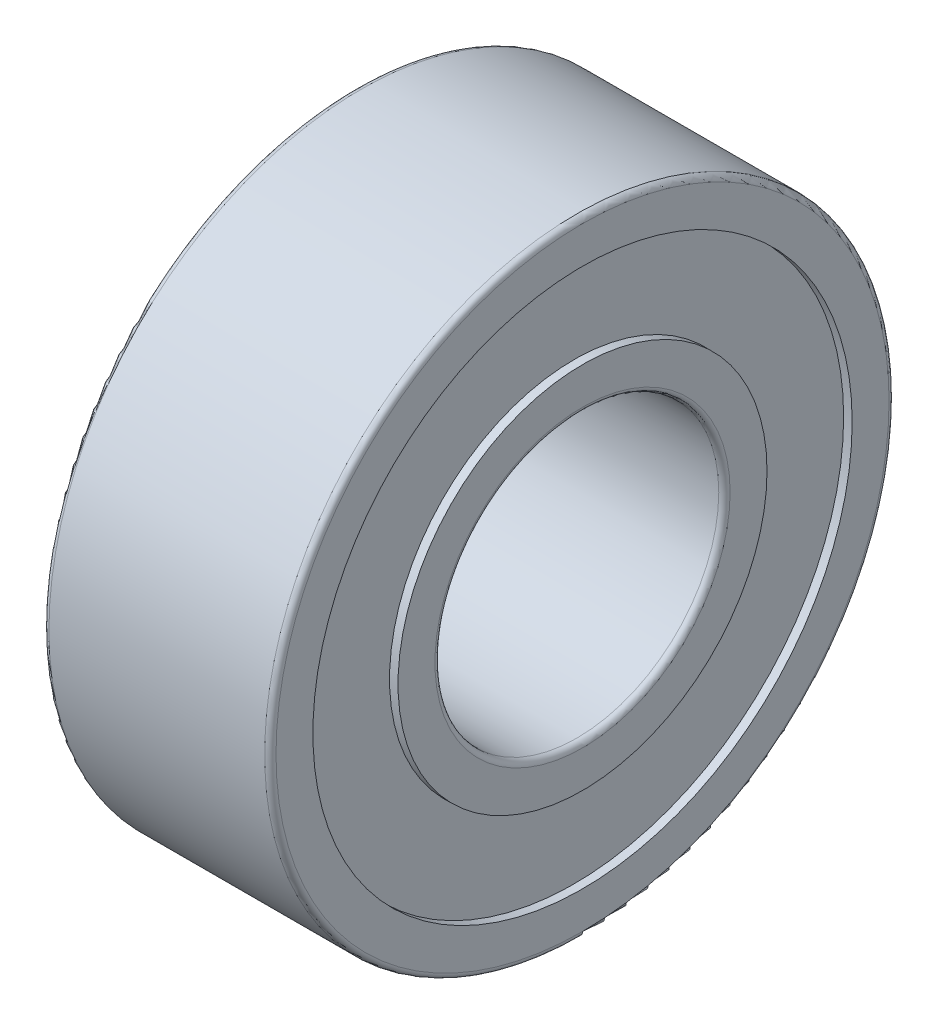
ISO-10303-21;
HEADER;
FILE_DESCRIPTION(('STEP AP214'),'2;1');
FILE_NAME('part.step','',(''),(''),'','','');
FILE_SCHEMA(('AUTOMOTIVE_DESIGN { 1 0 10303 214 1 1 1 1 }'));
ENDSEC;
DATA;
#1=APPLICATION_CONTEXT('core data for automotive mechanical design processes');
#2=APPLICATION_PROTOCOL_DEFINITION('international standard','automotive_design',2000,#1);
#3=PRODUCT_CONTEXT('',#1,'mechanical');
#4=PRODUCT('Part','Part','',(#3));
#5=PRODUCT_RELATED_PRODUCT_CATEGORY('part','',(#4));
#6=PRODUCT_DEFINITION_FORMATION('','',#4);
#7=PRODUCT_DEFINITION_CONTEXT('part definition',#1,'design');
#8=PRODUCT_DEFINITION('design','',#6,#7);
#9=PRODUCT_DEFINITION_SHAPE('','',#8);
#10=(LENGTH_UNIT() NAMED_UNIT(*) SI_UNIT(.MILLI.,.METRE.));
#11=(NAMED_UNIT(*) PLANE_ANGLE_UNIT() SI_UNIT($,.RADIAN.));
#12=(NAMED_UNIT(*) SI_UNIT($,.STERADIAN.) SOLID_ANGLE_UNIT());
#13=UNCERTAINTY_MEASURE_WITH_UNIT(LENGTH_MEASURE(1.E-05),#10,'distance_accuracy_value','');
#14=(GEOMETRIC_REPRESENTATION_CONTEXT(3) GLOBAL_UNCERTAINTY_ASSIGNED_CONTEXT((#13)) GLOBAL_UNIT_ASSIGNED_CONTEXT((#10,
#11,#12)) REPRESENTATION_CONTEXT('',''));
#15=CARTESIAN_POINT('',(0.,0.,0.));
#16=DIRECTION('',(0.,0.,1.));
#17=DIRECTION('',(1.,0.,0.));
#18=AXIS2_PLACEMENT_3D('',#15,#16,#17);
#19=CARTESIAN_POINT('',(-4.,5.,0.));
#20=DIRECTION('',(-1.,0.,0.));
#21=DIRECTION('',(0.,0.,1.));
#22=AXIS2_PLACEMENT_3D('',#19,#20,#21);
#23=PLANE('',#22);
#24=CARTESIAN_POINT('',(-4.,0.,0.));
#25=DIRECTION('',(-1.,0.,0.));
#26=DIRECTION('',(0.,0.,1.));
#27=AXIS2_PLACEMENT_3D('',#24,#25,#26);
#28=CIRCLE('',#27,5.2);
#29=CARTESIAN_POINT('',(-4.,0.,5.2));
#30=VERTEX_POINT('',#29);
#31=EDGE_CURVE('E62',#30,#30,#28,.F.);
#32=ORIENTED_EDGE('',*,*,#31,.T.);
#33=EDGE_LOOP('',(#32));
#34=FACE_BOUND('',#33,.T.);
#35=CARTESIAN_POINT('',(-4.,0.,0.));
#36=DIRECTION('',(1.,0.,0.));
#37=DIRECTION('',(0.,0.,-1.));
#38=AXIS2_PLACEMENT_3D('',#35,#36,#37);
#39=CIRCLE('',#38,6.5);
#40=CARTESIAN_POINT('',(-4.,0.,-6.5));
#41=VERTEX_POINT('',#40);
#42=EDGE_CURVE('E65',#41,#41,#39,.T.);
#43=ORIENTED_EDGE('',*,*,#42,.F.);
#44=EDGE_LOOP('',(#43));
#45=FACE_BOUND('',#44,.T.);
#46=ADVANCED_FACE('F33',(#34,#45),#23,.T.);
#47=CARTESIAN_POINT('',(0.,0.,0.));
#48=DIRECTION('',(1.,0.,0.));
#49=DIRECTION('',(0.,0.,-1.));
#50=AXIS2_PLACEMENT_3D('',#47,#48,#49);
#51=CYLINDRICAL_SURFACE('',#50,6.5);
#52=ORIENTED_EDGE('',*,*,#42,.T.);
#53=EDGE_LOOP('',(#52));
#54=FACE_BOUND('',#53,.T.);
#55=CARTESIAN_POINT('',(-3.7,0.,0.));
#56=DIRECTION('',(1.,0.,0.));
#57=DIRECTION('',(0.,0.,-1.));
#58=AXIS2_PLACEMENT_3D('',#55,#56,#57);
#59=CIRCLE('',#58,6.5);
#60=CARTESIAN_POINT('',(-3.7,0.,-6.5));
#61=VERTEX_POINT('',#60);
#62=EDGE_CURVE('E68',#61,#61,#59,.T.);
#63=ORIENTED_EDGE('',*,*,#62,.F.);
#64=EDGE_LOOP('',(#63));
#65=FACE_BOUND('',#64,.T.);
#66=ADVANCED_FACE('F108',(#54,#65),#51,.T.);
#67=CARTESIAN_POINT('',(-3.7,6.5,0.));
#68=DIRECTION('',(-1.,0.,0.));
#69=DIRECTION('',(0.,0.,1.));
#70=AXIS2_PLACEMENT_3D('',#67,#68,#69);
#71=PLANE('',#70);
#72=ORIENTED_EDGE('',*,*,#62,.T.);
#73=EDGE_LOOP('',(#72));
#74=FACE_BOUND('',#73,.T.);
#75=CARTESIAN_POINT('',(-3.7,0.,0.));
#76=DIRECTION('',(1.,0.,0.));
#77=DIRECTION('',(0.,0.,-1.));
#78=AXIS2_PLACEMENT_3D('',#75,#76,#77);
#79=CIRCLE('',#78,9.5);
#80=CARTESIAN_POINT('',(-3.7,0.,-9.5));
#81=VERTEX_POINT('',#80);
#82=EDGE_CURVE('E71',#81,#81,#79,.T.);
#83=ORIENTED_EDGE('',*,*,#82,.F.);
#84=EDGE_LOOP('',(#83));
#85=FACE_BOUND('',#84,.T.);
#86=ADVANCED_FACE('F114',(#74,#85),#71,.T.);
#87=CARTESIAN_POINT('',(0.,0.,0.));
#88=DIRECTION('',(1.,0.,0.));
#89=DIRECTION('',(0.,0.,-1.));
#90=AXIS2_PLACEMENT_3D('',#87,#88,#89);
#91=CYLINDRICAL_SURFACE('',#90,9.5);
#92=ORIENTED_EDGE('',*,*,#82,.T.);
#93=EDGE_LOOP('',(#92));
#94=FACE_BOUND('',#93,.T.);
#95=CARTESIAN_POINT('',(-4.,0.,0.));
#96=DIRECTION('',(1.,0.,0.));
#97=DIRECTION('',(0.,0.,-1.));
#98=AXIS2_PLACEMENT_3D('',#95,#96,#97);
#99=CIRCLE('',#98,9.5);
#100=CARTESIAN_POINT('',(-4.,0.,-9.5));
#101=VERTEX_POINT('',#100);
#102=EDGE_CURVE('E74',#101,#101,#99,.T.);
#103=ORIENTED_EDGE('',*,*,#102,.F.);
#104=EDGE_LOOP('',(#103));
#105=FACE_BOUND('',#104,.T.);
#106=ADVANCED_FACE('F150',(#94,#105),#91,.F.);
#107=CARTESIAN_POINT('',(-4.,9.5,0.));
#108=DIRECTION('',(-1.,0.,0.));
#109=DIRECTION('',(0.,0.,1.));
#110=AXIS2_PLACEMENT_3D('',#107,#108,#109);
#111=PLANE('',#110);
#112=CARTESIAN_POINT('',(-4.,0.,0.));
#113=DIRECTION('',(-1.,0.,0.));
#114=DIRECTION('',(0.,0.,1.));
#115=AXIS2_PLACEMENT_3D('',#112,#113,#114);
#116=CIRCLE('',#115,10.8);
#117=CARTESIAN_POINT('',(-4.,0.,10.8));
#118=VERTEX_POINT('',#117);
#119=EDGE_CURVE('E40',#118,#118,#116,.T.);
#120=ORIENTED_EDGE('',*,*,#119,.T.);
#121=EDGE_LOOP('',(#120));
#122=FACE_BOUND('',#121,.T.);
#123=ORIENTED_EDGE('',*,*,#102,.T.);
#124=EDGE_LOOP('',(#123));
#125=FACE_BOUND('',#124,.T.);
#126=ADVANCED_FACE('F141',(#122,#125),#111,.T.);
#127=CARTESIAN_POINT('',(0.,0.,0.));
#128=DIRECTION('',(1.,0.,0.));
#129=DIRECTION('',(0.,0.,-1.));
#130=AXIS2_PLACEMENT_3D('',#127,#128,#129);
#131=CYLINDRICAL_SURFACE('',#130,11.);
#132=CARTESIAN_POINT('',(-3.8,0.,0.));
#133=DIRECTION('',(-1.,0.,0.));
#134=DIRECTION('',(0.,0.,1.));
#135=AXIS2_PLACEMENT_3D('',#132,#133,#134);
#136=CIRCLE('',#135,11.);
#137=CARTESIAN_POINT('',(-3.8,0.,11.));
#138=VERTEX_POINT('',#137);
#139=EDGE_CURVE('E44',#138,#138,#136,.F.);
#140=ORIENTED_EDGE('',*,*,#139,.T.);
#141=EDGE_LOOP('',(#140));
#142=FACE_BOUND('',#141,.T.);
#143=CARTESIAN_POINT('',(3.8,0.,0.));
#144=DIRECTION('',(1.,0.,0.));
#145=DIRECTION('',(0.,0.,-1.));
#146=AXIS2_PLACEMENT_3D('',#143,#144,#145);
#147=CIRCLE('',#146,11.);
#148=CARTESIAN_POINT('',(3.8,0.,-11.));
#149=VERTEX_POINT('',#148);
#150=EDGE_CURVE('E48',#149,#149,#147,.F.);
#151=ORIENTED_EDGE('',*,*,#150,.T.);
#152=EDGE_LOOP('',(#151));
#153=FACE_BOUND('',#152,.T.);
#154=ADVANCED_FACE('F137',(#142,#153),#131,.T.);
#155=CARTESIAN_POINT('',(4.,9.5,0.));
#156=DIRECTION('',(1.,0.,0.));
#157=DIRECTION('',(0.,0.,-1.));
#158=AXIS2_PLACEMENT_3D('',#155,#156,#157);
#159=PLANE('',#158);
#160=CARTESIAN_POINT('',(4.,0.,0.));
#161=DIRECTION('',(1.,0.,0.));
#162=DIRECTION('',(0.,0.,-1.));
#163=AXIS2_PLACEMENT_3D('',#160,#161,#162);
#164=CIRCLE('',#163,10.8);
#165=CARTESIAN_POINT('',(4.,0.,-10.8));
#166=VERTEX_POINT('',#165);
#167=EDGE_CURVE('E10',#166,#166,#164,.T.);
#168=ORIENTED_EDGE('',*,*,#167,.T.);
#169=EDGE_LOOP('',(#168));
#170=FACE_BOUND('',#169,.T.);
#171=CARTESIAN_POINT('',(4.,0.,0.));
#172=DIRECTION('',(1.,0.,0.));
#173=DIRECTION('',(0.,0.,-1.));
#174=AXIS2_PLACEMENT_3D('',#171,#172,#173);
#175=CIRCLE('',#174,9.5);
#176=CARTESIAN_POINT('',(4.,0.,-9.5));
#177=VERTEX_POINT('',#176);
#178=EDGE_CURVE('E77',#177,#177,#175,.T.);
#179=ORIENTED_EDGE('',*,*,#178,.F.);
#180=EDGE_LOOP('',(#179));
#181=FACE_BOUND('',#180,.T.);
#182=ADVANCED_FACE('F140',(#170,#181),#159,.T.);
#183=CARTESIAN_POINT('',(0.,0.,0.));
#184=DIRECTION('',(1.,0.,0.));
#185=DIRECTION('',(0.,0.,-1.));
#186=AXIS2_PLACEMENT_3D('',#183,#184,#185);
#187=CYLINDRICAL_SURFACE('',#186,9.5);
#188=ORIENTED_EDGE('',*,*,#178,.T.);
#189=EDGE_LOOP('',(#188));
#190=FACE_BOUND('',#189,.T.);
#191=CARTESIAN_POINT('',(3.7,0.,0.));
#192=DIRECTION('',(1.,0.,0.));
#193=DIRECTION('',(0.,0.,-1.));
#194=AXIS2_PLACEMENT_3D('',#191,#192,#193);
#195=CIRCLE('',#194,9.5);
#196=CARTESIAN_POINT('',(3.7,0.,-9.5));
#197=VERTEX_POINT('',#196);
#198=EDGE_CURVE('E80',#197,#197,#195,.T.);
#199=ORIENTED_EDGE('',*,*,#198,.F.);
#200=EDGE_LOOP('',(#199));
#201=FACE_BOUND('',#200,.T.);
#202=ADVANCED_FACE('F104',(#190,#201),#187,.F.);
#203=CARTESIAN_POINT('',(3.7,6.5,0.));
#204=DIRECTION('',(1.,0.,0.));
#205=DIRECTION('',(0.,0.,-1.));
#206=AXIS2_PLACEMENT_3D('',#203,#204,#205);
#207=PLANE('',#206);
#208=ORIENTED_EDGE('',*,*,#198,.T.);
#209=EDGE_LOOP('',(#208));
#210=FACE_BOUND('',#209,.T.);
#211=CARTESIAN_POINT('',(3.7,0.,0.));
#212=DIRECTION('',(1.,0.,0.));
#213=DIRECTION('',(0.,0.,-1.));
#214=AXIS2_PLACEMENT_3D('',#211,#212,#213);
#215=CIRCLE('',#214,6.5);
#216=CARTESIAN_POINT('',(3.7,0.,-6.5));
#217=VERTEX_POINT('',#216);
#218=EDGE_CURVE('E83',#217,#217,#215,.T.);
#219=ORIENTED_EDGE('',*,*,#218,.F.);
#220=EDGE_LOOP('',(#219));
#221=FACE_BOUND('',#220,.T.);
#222=ADVANCED_FACE('F94',(#210,#221),#207,.T.);
#223=CARTESIAN_POINT('',(0.,0.,0.));
#224=DIRECTION('',(1.,0.,0.));
#225=DIRECTION('',(0.,0.,-1.));
#226=AXIS2_PLACEMENT_3D('',#223,#224,#225);
#227=CYLINDRICAL_SURFACE('',#226,6.5);
#228=ORIENTED_EDGE('',*,*,#218,.T.);
#229=EDGE_LOOP('',(#228));
#230=FACE_BOUND('',#229,.T.);
#231=CARTESIAN_POINT('',(4.,0.,0.));
#232=DIRECTION('',(1.,0.,0.));
#233=DIRECTION('',(0.,0.,-1.));
#234=AXIS2_PLACEMENT_3D('',#231,#232,#233);
#235=CIRCLE('',#234,6.5);
#236=CARTESIAN_POINT('',(4.,0.,-6.5));
#237=VERTEX_POINT('',#236);
#238=EDGE_CURVE('E86',#237,#237,#235,.T.);
#239=ORIENTED_EDGE('',*,*,#238,.F.);
#240=EDGE_LOOP('',(#239));
#241=FACE_BOUND('',#240,.T.);
#242=ADVANCED_FACE('F92',(#230,#241),#227,.T.);
#243=CARTESIAN_POINT('',(4.,5.,0.));
#244=DIRECTION('',(1.,0.,0.));
#245=DIRECTION('',(0.,0.,-1.));
#246=AXIS2_PLACEMENT_3D('',#243,#244,#245);
#247=PLANE('',#246);
#248=CARTESIAN_POINT('',(4.,0.,0.));
#249=DIRECTION('',(1.,0.,0.));
#250=DIRECTION('',(0.,0.,-1.));
#251=AXIS2_PLACEMENT_3D('',#248,#249,#250);
#252=CIRCLE('',#251,5.2);
#253=CARTESIAN_POINT('',(4.,0.,-5.2));
#254=VERTEX_POINT('',#253);
#255=EDGE_CURVE('E53',#254,#254,#252,.F.);
#256=ORIENTED_EDGE('',*,*,#255,.T.);
#257=EDGE_LOOP('',(#256));
#258=FACE_BOUND('',#257,.T.);
#259=ORIENTED_EDGE('',*,*,#238,.T.);
#260=EDGE_LOOP('',(#259));
#261=FACE_BOUND('',#260,.T.);
#262=ADVANCED_FACE('F90',(#258,#261),#247,.T.);
#263=CARTESIAN_POINT('',(0.,0.,0.));
#264=DIRECTION('',(1.,0.,0.));
#265=DIRECTION('',(0.,0.,-1.));
#266=AXIS2_PLACEMENT_3D('',#263,#264,#265);
#267=CYLINDRICAL_SURFACE('',#266,5.);
#268=CARTESIAN_POINT('',(-3.8,0.,0.));
#269=DIRECTION('',(-1.,0.,0.));
#270=DIRECTION('',(0.,0.,1.));
#271=AXIS2_PLACEMENT_3D('',#268,#269,#270);
#272=CIRCLE('',#271,5.);
#273=CARTESIAN_POINT('',(-3.8,0.,5.));
#274=VERTEX_POINT('',#273);
#275=EDGE_CURVE('E56',#274,#274,#272,.T.);
#276=ORIENTED_EDGE('',*,*,#275,.T.);
#277=EDGE_LOOP('',(#276));
#278=FACE_BOUND('',#277,.T.);
#279=CARTESIAN_POINT('',(3.8,0.,0.));
#280=DIRECTION('',(1.,0.,0.));
#281=DIRECTION('',(0.,0.,-1.));
#282=AXIS2_PLACEMENT_3D('',#279,#280,#281);
#283=CIRCLE('',#282,5.);
#284=CARTESIAN_POINT('',(3.8,0.,-5.));
#285=VERTEX_POINT('',#284);
#286=EDGE_CURVE('E59',#285,#285,#283,.T.);
#287=ORIENTED_EDGE('',*,*,#286,.T.);
#288=EDGE_LOOP('',(#287));
#289=FACE_BOUND('',#288,.T.);
#290=ADVANCED_FACE('F101',(#278,#289),#267,.F.);
#291=CARTESIAN_POINT('',(-3.8,0.,0.));
#292=DIRECTION('',(-1.,0.,0.));
#293=DIRECTION('',(0.,0.,1.));
#294=AXIS2_PLACEMENT_3D('',#291,#292,#293);
#295=TOROIDAL_SURFACE('',#294,5.2,0.2);
#296=ORIENTED_EDGE('',*,*,#275,.F.);
#297=EDGE_LOOP('',(#296));
#298=FACE_BOUND('',#297,.T.);
#299=ORIENTED_EDGE('',*,*,#31,.F.);
#300=EDGE_LOOP('',(#299));
#301=FACE_BOUND('',#300,.T.);
#302=ADVANCED_FACE('F120',(#298,#301),#295,.T.);
#303=CARTESIAN_POINT('',(3.8,0.,0.));
#304=DIRECTION('',(1.,0.,0.));
#305=DIRECTION('',(0.,0.,-1.));
#306=AXIS2_PLACEMENT_3D('',#303,#304,#305);
#307=TOROIDAL_SURFACE('',#306,5.2,0.2);
#308=ORIENTED_EDGE('',*,*,#255,.F.);
#309=EDGE_LOOP('',(#308));
#310=FACE_BOUND('',#309,.T.);
#311=ORIENTED_EDGE('',*,*,#286,.F.);
#312=EDGE_LOOP('',(#311));
#313=FACE_BOUND('',#312,.T.);
#314=ADVANCED_FACE('F123',(#310,#313),#307,.T.);
#315=CARTESIAN_POINT('',(-3.8,0.,0.));
#316=DIRECTION('',(-1.,0.,0.));
#317=DIRECTION('',(0.,0.,1.));
#318=AXIS2_PLACEMENT_3D('',#315,#316,#317);
#319=TOROIDAL_SURFACE('',#318,10.8,0.2);
#320=ORIENTED_EDGE('',*,*,#119,.F.);
#321=EDGE_LOOP('',(#320));
#322=FACE_BOUND('',#321,.T.);
#323=ORIENTED_EDGE('',*,*,#139,.F.);
#324=EDGE_LOOP('',(#323));
#325=FACE_BOUND('',#324,.T.);
#326=ADVANCED_FACE('F126',(#322,#325),#319,.T.);
#327=CARTESIAN_POINT('',(3.8,0.,0.));
#328=DIRECTION('',(1.,0.,0.));
#329=DIRECTION('',(0.,0.,-1.));
#330=AXIS2_PLACEMENT_3D('',#327,#328,#329);
#331=TOROIDAL_SURFACE('',#330,10.8,0.2);
#332=ORIENTED_EDGE('',*,*,#150,.F.);
#333=EDGE_LOOP('',(#332));
#334=FACE_BOUND('',#333,.T.);
#335=ORIENTED_EDGE('',*,*,#167,.F.);
#336=EDGE_LOOP('',(#335));
#337=FACE_BOUND('',#336,.T.);
#338=ADVANCED_FACE('F35',(#334,#337),#331,.T.);
#339=CLOSED_SHELL('',(#46,#66,#86,#106,#126,#154,#182,#202,#222,#242,#262,#290,#302,#314,#326,#338));
#340=MANIFOLD_SOLID_BREP('B2',#339);
#341=ADVANCED_BREP_SHAPE_REPRESENTATION('',(#18,#340),#14);
#342=SHAPE_DEFINITION_REPRESENTATION(#9,#341);
ENDSEC;
END-ISO-10303-21;
